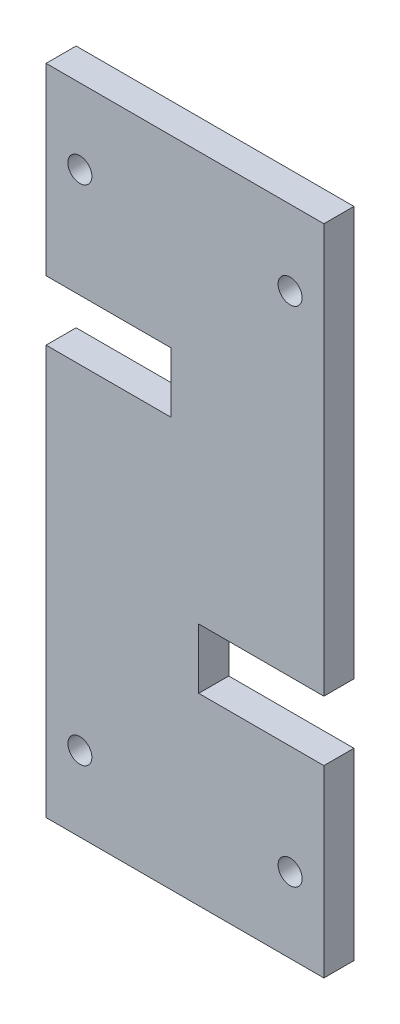
ISO-10303-21;
HEADER;
FILE_DESCRIPTION(('STEP AP214'),'2;1');
FILE_NAME('part.step','',(''),(''),'','','');
FILE_SCHEMA(('AUTOMOTIVE_DESIGN { 1 0 10303 214 1 1 1 1 }'));
ENDSEC;
DATA;
#1=APPLICATION_CONTEXT('core data for automotive mechanical design processes');
#2=APPLICATION_PROTOCOL_DEFINITION('international standard','automotive_design',2000,#1);
#3=PRODUCT_CONTEXT('',#1,'mechanical');
#4=PRODUCT('Part','Part','',(#3));
#5=PRODUCT_RELATED_PRODUCT_CATEGORY('part','',(#4));
#6=PRODUCT_DEFINITION_FORMATION('','',#4);
#7=PRODUCT_DEFINITION_CONTEXT('part definition',#1,'design');
#8=PRODUCT_DEFINITION('design','',#6,#7);
#9=PRODUCT_DEFINITION_SHAPE('','',#8);
#10=(LENGTH_UNIT() NAMED_UNIT(*) SI_UNIT(.MILLI.,.METRE.));
#11=(NAMED_UNIT(*) PLANE_ANGLE_UNIT() SI_UNIT($,.RADIAN.));
#12=(NAMED_UNIT(*) SI_UNIT($,.STERADIAN.) SOLID_ANGLE_UNIT());
#13=UNCERTAINTY_MEASURE_WITH_UNIT(LENGTH_MEASURE(1.E-05),#10,'distance_accuracy_value','');
#14=(GEOMETRIC_REPRESENTATION_CONTEXT(3) GLOBAL_UNCERTAINTY_ASSIGNED_CONTEXT((#13)) GLOBAL_UNIT_ASSIGNED_CONTEXT((#10,
#11,#12)) REPRESENTATION_CONTEXT('',''));
#15=CARTESIAN_POINT('',(0.,0.,0.));
#16=DIRECTION('',(0.,0.,1.));
#17=DIRECTION('',(1.,0.,0.));
#18=AXIS2_PLACEMENT_3D('',#15,#16,#17);
#19=CARTESIAN_POINT('',(18.5,43.5,4.));
#20=DIRECTION('',(-1.,0.,0.));
#21=DIRECTION('',(0.,0.,1.));
#22=AXIS2_PLACEMENT_3D('',#19,#20,#21);
#23=PLANE('',#22);
#24=DIRECTION('',(0.,1.,0.));
#25=VECTOR('',#24,1.);
#26=CARTESIAN_POINT('',(18.5,43.5,0.));
#27=LINE('',#26,#25);
#28=CARTESIAN_POINT('',(18.5,-43.5,0.));
#29=VERTEX_POINT('',#28);
#30=CARTESIAN_POINT('',(18.5,-19.,0.));
#31=VERTEX_POINT('',#30);
#32=EDGE_CURVE('E221',#29,#31,#27,.T.);
#33=ORIENTED_EDGE('',*,*,#32,.T.);
#34=DIRECTION('',(0.,0.,1.));
#35=VECTOR('',#34,1.);
#36=CARTESIAN_POINT('',(18.5,-19.,0.));
#37=LINE('',#36,#35);
#38=CARTESIAN_POINT('',(18.5,-19.,4.));
#39=VERTEX_POINT('',#38);
#40=EDGE_CURVE('E153',#31,#39,#37,.T.);
#41=ORIENTED_EDGE('',*,*,#40,.T.);
#42=DIRECTION('',(0.,1.,0.));
#43=VECTOR('',#42,1.);
#44=CARTESIAN_POINT('',(18.5,43.5,4.));
#45=LINE('',#44,#43);
#46=CARTESIAN_POINT('',(18.5,-43.5,4.));
#47=VERTEX_POINT('',#46);
#48=EDGE_CURVE('E208',#47,#39,#45,.T.);
#49=ORIENTED_EDGE('',*,*,#48,.F.);
#50=DIRECTION('',(0.,0.,-1.));
#51=VECTOR('',#50,1.);
#52=CARTESIAN_POINT('',(18.5,-43.5,4.));
#53=LINE('',#52,#51);
#54=EDGE_CURVE('E220',#47,#29,#53,.T.);
#55=ORIENTED_EDGE('',*,*,#54,.T.);
#56=EDGE_LOOP('',(#33,#41,#49,#55));
#57=FACE_BOUND('',#56,.T.);
#58=ADVANCED_FACE('F35',(#57),#23,.F.);
#59=CARTESIAN_POINT('',(-18.5,43.5,4.));
#60=DIRECTION('',(1.,0.,0.));
#61=DIRECTION('',(0.,0.,-1.));
#62=AXIS2_PLACEMENT_3D('',#59,#60,#61);
#63=PLANE('',#62);
#64=DIRECTION('',(0.,-1.,0.));
#65=VECTOR('',#64,1.);
#66=CARTESIAN_POINT('',(-18.5,43.5,0.));
#67=LINE('',#66,#65);
#68=CARTESIAN_POINT('',(-18.5,43.5,0.));
#69=VERTEX_POINT('',#68);
#70=CARTESIAN_POINT('',(-18.5,19.,0.));
#71=VERTEX_POINT('',#70);
#72=EDGE_CURVE('E226',#69,#71,#67,.T.);
#73=ORIENTED_EDGE('',*,*,#72,.T.);
#74=DIRECTION('',(0.,0.,1.));
#75=VECTOR('',#74,1.);
#76=CARTESIAN_POINT('',(-18.5,19.,0.));
#77=LINE('',#76,#75);
#78=CARTESIAN_POINT('',(-18.5,19.,4.));
#79=VERTEX_POINT('',#78);
#80=EDGE_CURVE('E155',#71,#79,#77,.T.);
#81=ORIENTED_EDGE('',*,*,#80,.T.);
#82=DIRECTION('',(0.,-1.,0.));
#83=VECTOR('',#82,1.);
#84=CARTESIAN_POINT('',(-18.5,43.5,4.));
#85=LINE('',#84,#83);
#86=CARTESIAN_POINT('',(-18.5,43.5,4.));
#87=VERTEX_POINT('',#86);
#88=EDGE_CURVE('E215',#87,#79,#85,.T.);
#89=ORIENTED_EDGE('',*,*,#88,.F.);
#90=DIRECTION('',(0.,0.,-1.));
#91=VECTOR('',#90,1.);
#92=CARTESIAN_POINT('',(-18.5,43.5,4.));
#93=LINE('',#92,#91);
#94=EDGE_CURVE('E43',#87,#69,#93,.T.);
#95=ORIENTED_EDGE('',*,*,#94,.T.);
#96=EDGE_LOOP('',(#73,#81,#89,#95));
#97=FACE_BOUND('',#96,.T.);
#98=ADVANCED_FACE('F240',(#97),#63,.F.);
#99=CARTESIAN_POINT('',(0.,0.,4.));
#100=DIRECTION('',(0.,0.,1.));
#101=DIRECTION('',(1.,0.,0.));
#102=AXIS2_PLACEMENT_3D('',#99,#100,#101);
#103=PLANE('',#102);
#104=DIRECTION('',(-1.,0.,0.));
#105=VECTOR('',#104,1.);
#106=CARTESIAN_POINT('',(-18.5,19.,4.));
#107=LINE('',#106,#105);
#108=CARTESIAN_POINT('',(-1.83,19.,4.));
#109=VERTEX_POINT('',#108);
#110=EDGE_CURVE('E146',#109,#79,#107,.T.);
#111=ORIENTED_EDGE('',*,*,#110,.F.);
#112=DIRECTION('',(0.,1.,0.));
#113=VECTOR('',#112,1.);
#114=CARTESIAN_POINT('',(-1.83,19.,4.));
#115=LINE('',#114,#113);
#116=CARTESIAN_POINT('',(-1.83,11.,4.));
#117=VERTEX_POINT('',#116);
#118=EDGE_CURVE('E148',#117,#109,#115,.T.);
#119=ORIENTED_EDGE('',*,*,#118,.F.);
#120=DIRECTION('',(1.,0.,0.));
#121=VECTOR('',#120,1.);
#122=CARTESIAN_POINT('',(-18.5,11.,4.));
#123=LINE('',#122,#121);
#124=CARTESIAN_POINT('',(-18.5,11.,4.));
#125=VERTEX_POINT('',#124);
#126=EDGE_CURVE('E126',#125,#117,#123,.T.);
#127=ORIENTED_EDGE('',*,*,#126,.F.);
#128=CARTESIAN_POINT('',(-18.5,-43.5,4.));
#129=VERTEX_POINT('',#128);
#130=EDGE_CURVE('E214',#125,#129,#85,.T.);
#131=ORIENTED_EDGE('',*,*,#130,.T.);
#132=DIRECTION('',(1.,0.,0.));
#133=VECTOR('',#132,1.);
#134=CARTESIAN_POINT('',(-18.5,-43.5,4.));
#135=LINE('',#134,#133);
#136=EDGE_CURVE('E218',#129,#47,#135,.T.);
#137=ORIENTED_EDGE('',*,*,#136,.T.);
#138=ORIENTED_EDGE('',*,*,#48,.T.);
#139=DIRECTION('',(1.,0.,0.));
#140=VECTOR('',#139,1.);
#141=CARTESIAN_POINT('',(18.5,-19.,4.));
#142=LINE('',#141,#140);
#143=CARTESIAN_POINT('',(1.83000000000001,-19.,4.));
#144=VERTEX_POINT('',#143);
#145=EDGE_CURVE('E163',#144,#39,#142,.T.);
#146=ORIENTED_EDGE('',*,*,#145,.F.);
#147=DIRECTION('',(0.,-1.,0.));
#148=VECTOR('',#147,1.);
#149=CARTESIAN_POINT('',(1.83000000000001,-11.,4.));
#150=LINE('',#149,#148);
#151=CARTESIAN_POINT('',(1.83000000000001,-11.,4.));
#152=VERTEX_POINT('',#151);
#153=EDGE_CURVE('E173',#152,#144,#150,.T.);
#154=ORIENTED_EDGE('',*,*,#153,.F.);
#155=DIRECTION('',(-1.,0.,0.));
#156=VECTOR('',#155,1.);
#157=CARTESIAN_POINT('',(18.5,-11.,4.));
#158=LINE('',#157,#156);
#159=CARTESIAN_POINT('',(18.5,-11.,4.));
#160=VERTEX_POINT('',#159);
#161=EDGE_CURVE('E170',#160,#152,#158,.T.);
#162=ORIENTED_EDGE('',*,*,#161,.F.);
#163=CARTESIAN_POINT('',(18.5,43.5,4.));
#164=VERTEX_POINT('',#163);
#165=EDGE_CURVE('E212',#160,#164,#45,.T.);
#166=ORIENTED_EDGE('',*,*,#165,.T.);
#167=DIRECTION('',(-1.,0.,0.));
#168=VECTOR('',#167,1.);
#169=CARTESIAN_POINT('',(-18.5,43.5,4.));
#170=LINE('',#169,#168);
#171=EDGE_CURVE('E211',#164,#87,#170,.T.);
#172=ORIENTED_EDGE('',*,*,#171,.T.);
#173=ORIENTED_EDGE('',*,*,#88,.T.);
#174=EDGE_LOOP('',(#111,#119,#127,#131,#137,#138,#146,#154,#162,#166,#172,#173));
#175=FACE_BOUND('',#174,.T.);
#176=CARTESIAN_POINT('',(-14.,-33.5,4.));
#177=DIRECTION('',(0.,0.,1.));
#178=DIRECTION('',(1.,0.,0.));
#179=AXIS2_PLACEMENT_3D('',#176,#177,#178);
#180=CIRCLE('',#179,1.6);
#181=CARTESIAN_POINT('',(-12.4,-33.5,4.));
#182=VERTEX_POINT('',#181);
#183=EDGE_CURVE('E190',#182,#182,#180,.T.);
#184=ORIENTED_EDGE('',*,*,#183,.F.);
#185=EDGE_LOOP('',(#184));
#186=FACE_BOUND('',#185,.T.);
#187=CARTESIAN_POINT('',(-14.,33.5,4.));
#188=DIRECTION('',(0.,0.,1.));
#189=DIRECTION('',(1.,0.,0.));
#190=AXIS2_PLACEMENT_3D('',#187,#188,#189);
#191=CIRCLE('',#190,1.6);
#192=CARTESIAN_POINT('',(-12.4,33.5,4.));
#193=VERTEX_POINT('',#192);
#194=EDGE_CURVE('E202',#193,#193,#191,.T.);
#195=ORIENTED_EDGE('',*,*,#194,.F.);
#196=EDGE_LOOP('',(#195));
#197=FACE_BOUND('',#196,.T.);
#198=CARTESIAN_POINT('',(14.,33.5,4.));
#199=DIRECTION('',(0.,0.,1.));
#200=DIRECTION('',(1.,0.,0.));
#201=AXIS2_PLACEMENT_3D('',#198,#199,#200);
#202=CIRCLE('',#201,1.6);
#203=CARTESIAN_POINT('',(15.6,33.5,4.));
#204=VERTEX_POINT('',#203);
#205=EDGE_CURVE('E196',#204,#204,#202,.T.);
#206=ORIENTED_EDGE('',*,*,#205,.F.);
#207=EDGE_LOOP('',(#206));
#208=FACE_BOUND('',#207,.T.);
#209=CARTESIAN_POINT('',(14.,-33.5,4.));
#210=DIRECTION('',(0.,0.,1.));
#211=DIRECTION('',(1.,0.,0.));
#212=AXIS2_PLACEMENT_3D('',#209,#210,#211);
#213=CIRCLE('',#212,1.6);
#214=CARTESIAN_POINT('',(15.6,-33.5,4.));
#215=VERTEX_POINT('',#214);
#216=EDGE_CURVE('E184',#215,#215,#213,.T.);
#217=ORIENTED_EDGE('',*,*,#216,.F.);
#218=EDGE_LOOP('',(#217));
#219=FACE_BOUND('',#218,.T.);
#220=ADVANCED_FACE('F249',(#175,#186,#197,#208,#219),#103,.T.);
#221=CARTESIAN_POINT('',(0.,0.,0.));
#222=DIRECTION('',(0.,0.,1.));
#223=DIRECTION('',(1.,0.,0.));
#224=AXIS2_PLACEMENT_3D('',#221,#222,#223);
#225=PLANE('',#224);
#226=DIRECTION('',(0.,1.,0.));
#227=VECTOR('',#226,1.);
#228=CARTESIAN_POINT('',(-1.83,19.,0.));
#229=LINE('',#228,#227);
#230=CARTESIAN_POINT('',(-1.83,11.,0.));
#231=VERTEX_POINT('',#230);
#232=CARTESIAN_POINT('',(-1.83,19.,0.));
#233=VERTEX_POINT('',#232);
#234=EDGE_CURVE('E134',#231,#233,#229,.T.);
#235=ORIENTED_EDGE('',*,*,#234,.T.);
#236=DIRECTION('',(-1.,0.,0.));
#237=VECTOR('',#236,1.);
#238=CARTESIAN_POINT('',(-18.5,19.,0.));
#239=LINE('',#238,#237);
#240=EDGE_CURVE('E139',#233,#71,#239,.T.);
#241=ORIENTED_EDGE('',*,*,#240,.T.);
#242=ORIENTED_EDGE('',*,*,#72,.F.);
#243=DIRECTION('',(-1.,0.,0.));
#244=VECTOR('',#243,1.);
#245=CARTESIAN_POINT('',(-18.5,43.5,0.));
#246=LINE('',#245,#244);
#247=CARTESIAN_POINT('',(18.5,43.5,0.));
#248=VERTEX_POINT('',#247);
#249=EDGE_CURVE('E224',#248,#69,#246,.T.);
#250=ORIENTED_EDGE('',*,*,#249,.F.);
#251=CARTESIAN_POINT('',(18.5,-11.,0.));
#252=VERTEX_POINT('',#251);
#253=EDGE_CURVE('E205',#252,#248,#27,.T.);
#254=ORIENTED_EDGE('',*,*,#253,.F.);
#255=DIRECTION('',(-1.,0.,0.));
#256=VECTOR('',#255,1.);
#257=CARTESIAN_POINT('',(18.5,-11.,0.));
#258=LINE('',#257,#256);
#259=CARTESIAN_POINT('',(1.83000000000001,-11.,0.));
#260=VERTEX_POINT('',#259);
#261=EDGE_CURVE('E50',#252,#260,#258,.T.);
#262=ORIENTED_EDGE('',*,*,#261,.T.);
#263=DIRECTION('',(0.,-1.,0.));
#264=VECTOR('',#263,1.);
#265=CARTESIAN_POINT('',(1.83000000000001,-11.,0.));
#266=LINE('',#265,#264);
#267=CARTESIAN_POINT('',(1.83000000000001,-19.,0.));
#268=VERTEX_POINT('',#267);
#269=EDGE_CURVE('E162',#260,#268,#266,.T.);
#270=ORIENTED_EDGE('',*,*,#269,.T.);
#271=DIRECTION('',(1.,0.,0.));
#272=VECTOR('',#271,1.);
#273=CARTESIAN_POINT('',(18.5,-19.,0.));
#274=LINE('',#273,#272);
#275=EDGE_CURVE('E166',#268,#31,#274,.T.);
#276=ORIENTED_EDGE('',*,*,#275,.T.);
#277=ORIENTED_EDGE('',*,*,#32,.F.);
#278=DIRECTION('',(1.,0.,0.));
#279=VECTOR('',#278,1.);
#280=CARTESIAN_POINT('',(-18.5,-43.5,0.));
#281=LINE('',#280,#279);
#282=CARTESIAN_POINT('',(-18.5,-43.5,0.));
#283=VERTEX_POINT('',#282);
#284=EDGE_CURVE('E229',#283,#29,#281,.T.);
#285=ORIENTED_EDGE('',*,*,#284,.F.);
#286=CARTESIAN_POINT('',(-18.5,11.,0.));
#287=VERTEX_POINT('',#286);
#288=EDGE_CURVE('E145',#287,#283,#67,.T.);
#289=ORIENTED_EDGE('',*,*,#288,.F.);
#290=DIRECTION('',(1.,0.,0.));
#291=VECTOR('',#290,1.);
#292=CARTESIAN_POINT('',(-18.5,11.,0.));
#293=LINE('',#292,#291);
#294=EDGE_CURVE('E58',#287,#231,#293,.T.);
#295=ORIENTED_EDGE('',*,*,#294,.T.);
#296=EDGE_LOOP('',(#235,#241,#242,#250,#254,#262,#270,#276,#277,#285,#289,#295));
#297=FACE_BOUND('',#296,.T.);
#298=CARTESIAN_POINT('',(-14.,33.5,0.));
#299=DIRECTION('',(0.,0.,1.));
#300=DIRECTION('',(1.,0.,0.));
#301=AXIS2_PLACEMENT_3D('',#298,#299,#300);
#302=CIRCLE('',#301,1.6);
#303=CARTESIAN_POINT('',(-12.4,33.5,0.));
#304=VERTEX_POINT('',#303);
#305=EDGE_CURVE('E199',#304,#304,#302,.T.);
#306=ORIENTED_EDGE('',*,*,#305,.T.);
#307=EDGE_LOOP('',(#306));
#308=FACE_BOUND('',#307,.T.);
#309=CARTESIAN_POINT('',(14.,33.5,0.));
#310=DIRECTION('',(0.,0.,1.));
#311=DIRECTION('',(1.,0.,0.));
#312=AXIS2_PLACEMENT_3D('',#309,#310,#311);
#313=CIRCLE('',#312,1.6);
#314=CARTESIAN_POINT('',(15.6,33.5,0.));
#315=VERTEX_POINT('',#314);
#316=EDGE_CURVE('E193',#315,#315,#313,.T.);
#317=ORIENTED_EDGE('',*,*,#316,.T.);
#318=EDGE_LOOP('',(#317));
#319=FACE_BOUND('',#318,.T.);
#320=CARTESIAN_POINT('',(-14.,-33.5,0.));
#321=DIRECTION('',(0.,0.,1.));
#322=DIRECTION('',(1.,0.,0.));
#323=AXIS2_PLACEMENT_3D('',#320,#321,#322);
#324=CIRCLE('',#323,1.6);
#325=CARTESIAN_POINT('',(-12.4,-33.5,0.));
#326=VERTEX_POINT('',#325);
#327=EDGE_CURVE('E187',#326,#326,#324,.T.);
#328=ORIENTED_EDGE('',*,*,#327,.T.);
#329=EDGE_LOOP('',(#328));
#330=FACE_BOUND('',#329,.T.);
#331=CARTESIAN_POINT('',(14.,-33.5,0.));
#332=DIRECTION('',(0.,0.,1.));
#333=DIRECTION('',(1.,0.,0.));
#334=AXIS2_PLACEMENT_3D('',#331,#332,#333);
#335=CIRCLE('',#334,1.6);
#336=CARTESIAN_POINT('',(15.6,-33.5,0.));
#337=VERTEX_POINT('',#336);
#338=EDGE_CURVE('E158',#337,#337,#335,.T.);
#339=ORIENTED_EDGE('',*,*,#338,.T.);
#340=EDGE_LOOP('',(#339));
#341=FACE_BOUND('',#340,.T.);
#342=ADVANCED_FACE('F142',(#297,#308,#319,#330,#341),#225,.F.);
#343=ORIENTED_EDGE('',*,*,#165,.F.);
#344=DIRECTION('',(0.,0.,1.));
#345=VECTOR('',#344,1.);
#346=CARTESIAN_POINT('',(18.5,-11.,0.));
#347=LINE('',#346,#345);
#348=EDGE_CURVE('E169',#252,#160,#347,.T.);
#349=ORIENTED_EDGE('',*,*,#348,.F.);
#350=ORIENTED_EDGE('',*,*,#253,.T.);
#351=DIRECTION('',(0.,0.,-1.));
#352=VECTOR('',#351,1.);
#353=CARTESIAN_POINT('',(18.5,43.5,4.));
#354=LINE('',#353,#352);
#355=EDGE_CURVE('E11',#164,#248,#354,.T.);
#356=ORIENTED_EDGE('',*,*,#355,.F.);
#357=EDGE_LOOP('',(#343,#349,#350,#356));
#358=FACE_BOUND('',#357,.T.);
#359=ADVANCED_FACE('F37',(#358),#23,.F.);
#360=CARTESIAN_POINT('',(-18.5,43.5,4.));
#361=DIRECTION('',(0.,-1.,0.));
#362=DIRECTION('',(0.,0.,-1.));
#363=AXIS2_PLACEMENT_3D('',#360,#361,#362);
#364=PLANE('',#363);
#365=ORIENTED_EDGE('',*,*,#249,.T.);
#366=ORIENTED_EDGE('',*,*,#94,.F.);
#367=ORIENTED_EDGE('',*,*,#171,.F.);
#368=ORIENTED_EDGE('',*,*,#355,.T.);
#369=EDGE_LOOP('',(#365,#366,#367,#368));
#370=FACE_BOUND('',#369,.T.);
#371=ADVANCED_FACE('F254',(#370),#364,.F.);
#372=ORIENTED_EDGE('',*,*,#130,.F.);
#373=DIRECTION('',(0.,0.,1.));
#374=VECTOR('',#373,1.);
#375=CARTESIAN_POINT('',(-18.5,11.,0.));
#376=LINE('',#375,#374);
#377=EDGE_CURVE('E131',#287,#125,#376,.T.);
#378=ORIENTED_EDGE('',*,*,#377,.F.);
#379=ORIENTED_EDGE('',*,*,#288,.T.);
#380=DIRECTION('',(0.,0.,-1.));
#381=VECTOR('',#380,1.);
#382=CARTESIAN_POINT('',(-18.5,-43.5,4.));
#383=LINE('',#382,#381);
#384=EDGE_CURVE('E233',#129,#283,#383,.T.);
#385=ORIENTED_EDGE('',*,*,#384,.F.);
#386=EDGE_LOOP('',(#372,#378,#379,#385));
#387=FACE_BOUND('',#386,.T.);
#388=ADVANCED_FACE('F274',(#387),#63,.F.);
#389=CARTESIAN_POINT('',(-18.5,-43.5,4.));
#390=DIRECTION('',(0.,1.,0.));
#391=DIRECTION('',(0.,0.,1.));
#392=AXIS2_PLACEMENT_3D('',#389,#390,#391);
#393=PLANE('',#392);
#394=ORIENTED_EDGE('',*,*,#284,.T.);
#395=ORIENTED_EDGE('',*,*,#54,.F.);
#396=ORIENTED_EDGE('',*,*,#136,.F.);
#397=ORIENTED_EDGE('',*,*,#384,.T.);
#398=EDGE_LOOP('',(#394,#395,#396,#397));
#399=FACE_BOUND('',#398,.T.);
#400=ADVANCED_FACE('F272',(#399),#393,.F.);
#401=CARTESIAN_POINT('',(-14.,33.5,4.));
#402=DIRECTION('',(0.,0.,-1.));
#403=DIRECTION('',(-1.,0.,0.));
#404=AXIS2_PLACEMENT_3D('',#401,#402,#403);
#405=CYLINDRICAL_SURFACE('',#404,1.6);
#406=ORIENTED_EDGE('',*,*,#194,.T.);
#407=EDGE_LOOP('',(#406));
#408=FACE_BOUND('',#407,.T.);
#409=ORIENTED_EDGE('',*,*,#305,.F.);
#410=EDGE_LOOP('',(#409));
#411=FACE_BOUND('',#410,.T.);
#412=ADVANCED_FACE('F281',(#408,#411),#405,.F.);
#413=CARTESIAN_POINT('',(14.,33.5,4.));
#414=DIRECTION('',(0.,0.,-1.));
#415=DIRECTION('',(-1.,0.,0.));
#416=AXIS2_PLACEMENT_3D('',#413,#414,#415);
#417=CYLINDRICAL_SURFACE('',#416,1.6);
#418=ORIENTED_EDGE('',*,*,#205,.T.);
#419=EDGE_LOOP('',(#418));
#420=FACE_BOUND('',#419,.T.);
#421=ORIENTED_EDGE('',*,*,#316,.F.);
#422=EDGE_LOOP('',(#421));
#423=FACE_BOUND('',#422,.T.);
#424=ADVANCED_FACE('F299',(#420,#423),#417,.F.);
#425=CARTESIAN_POINT('',(-14.,-33.5,4.));
#426=DIRECTION('',(0.,0.,-1.));
#427=DIRECTION('',(-1.,0.,0.));
#428=AXIS2_PLACEMENT_3D('',#425,#426,#427);
#429=CYLINDRICAL_SURFACE('',#428,1.6);
#430=ORIENTED_EDGE('',*,*,#183,.T.);
#431=EDGE_LOOP('',(#430));
#432=FACE_BOUND('',#431,.T.);
#433=ORIENTED_EDGE('',*,*,#327,.F.);
#434=EDGE_LOOP('',(#433));
#435=FACE_BOUND('',#434,.T.);
#436=ADVANCED_FACE('F303',(#432,#435),#429,.F.);
#437=CARTESIAN_POINT('',(14.,-33.5,4.));
#438=DIRECTION('',(0.,0.,-1.));
#439=DIRECTION('',(-1.,0.,0.));
#440=AXIS2_PLACEMENT_3D('',#437,#438,#439);
#441=CYLINDRICAL_SURFACE('',#440,1.6);
#442=ORIENTED_EDGE('',*,*,#216,.T.);
#443=EDGE_LOOP('',(#442));
#444=FACE_BOUND('',#443,.T.);
#445=ORIENTED_EDGE('',*,*,#338,.F.);
#446=EDGE_LOOP('',(#445));
#447=FACE_BOUND('',#446,.T.);
#448=ADVANCED_FACE('F307',(#444,#447),#441,.F.);
#449=CARTESIAN_POINT('',(-18.5,19.,0.));
#450=DIRECTION('',(0.,1.,0.));
#451=DIRECTION('',(0.,0.,1.));
#452=AXIS2_PLACEMENT_3D('',#449,#450,#451);
#453=PLANE('',#452);
#454=ORIENTED_EDGE('',*,*,#110,.T.);
#455=ORIENTED_EDGE('',*,*,#80,.F.);
#456=ORIENTED_EDGE('',*,*,#240,.F.);
#457=DIRECTION('',(0.,0.,1.));
#458=VECTOR('',#457,1.);
#459=CARTESIAN_POINT('',(-1.83,19.,0.));
#460=LINE('',#459,#458);
#461=EDGE_CURVE('E130',#233,#109,#460,.T.);
#462=ORIENTED_EDGE('',*,*,#461,.T.);
#463=EDGE_LOOP('',(#454,#455,#456,#462));
#464=FACE_BOUND('',#463,.T.);
#465=ADVANCED_FACE('F246',(#464),#453,.F.);
#466=CARTESIAN_POINT('',(-1.83,19.,0.));
#467=DIRECTION('',(1.,0.,0.));
#468=DIRECTION('',(0.,1.,0.));
#469=AXIS2_PLACEMENT_3D('',#466,#467,#468);
#470=PLANE('',#469);
#471=ORIENTED_EDGE('',*,*,#118,.T.);
#472=ORIENTED_EDGE('',*,*,#461,.F.);
#473=ORIENTED_EDGE('',*,*,#234,.F.);
#474=DIRECTION('',(0.,0.,1.));
#475=VECTOR('',#474,1.);
#476=CARTESIAN_POINT('',(-1.83,11.,0.));
#477=LINE('',#476,#475);
#478=EDGE_CURVE('E122',#231,#117,#477,.T.);
#479=ORIENTED_EDGE('',*,*,#478,.T.);
#480=EDGE_LOOP('',(#471,#472,#473,#479));
#481=FACE_BOUND('',#480,.T.);
#482=ADVANCED_FACE('F135',(#481),#470,.F.);
#483=CARTESIAN_POINT('',(-18.5,11.,0.));
#484=DIRECTION('',(0.,-1.,0.));
#485=DIRECTION('',(0.,0.,-1.));
#486=AXIS2_PLACEMENT_3D('',#483,#484,#485);
#487=PLANE('',#486);
#488=ORIENTED_EDGE('',*,*,#126,.T.);
#489=ORIENTED_EDGE('',*,*,#478,.F.);
#490=ORIENTED_EDGE('',*,*,#294,.F.);
#491=ORIENTED_EDGE('',*,*,#377,.T.);
#492=EDGE_LOOP('',(#488,#489,#490,#491));
#493=FACE_BOUND('',#492,.T.);
#494=ADVANCED_FACE('F124',(#493),#487,.F.);
#495=CARTESIAN_POINT('',(18.5,-19.,0.));
#496=DIRECTION('',(0.,-1.,0.));
#497=DIRECTION('',(1.,0.,0.));
#498=AXIS2_PLACEMENT_3D('',#495,#496,#497);
#499=PLANE('',#498);
#500=ORIENTED_EDGE('',*,*,#145,.T.);
#501=ORIENTED_EDGE('',*,*,#40,.F.);
#502=ORIENTED_EDGE('',*,*,#275,.F.);
#503=DIRECTION('',(0.,0.,1.));
#504=VECTOR('',#503,1.);
#505=CARTESIAN_POINT('',(1.83000000000001,-19.,0.));
#506=LINE('',#505,#504);
#507=EDGE_CURVE('E179',#268,#144,#506,.T.);
#508=ORIENTED_EDGE('',*,*,#507,.T.);
#509=EDGE_LOOP('',(#500,#501,#502,#508));
#510=FACE_BOUND('',#509,.T.);
#511=ADVANCED_FACE('F264',(#510),#499,.F.);
#512=CARTESIAN_POINT('',(1.83000000000001,-11.,0.));
#513=DIRECTION('',(-1.,0.,0.));
#514=DIRECTION('',(0.,-1.,0.));
#515=AXIS2_PLACEMENT_3D('',#512,#513,#514);
#516=PLANE('',#515);
#517=ORIENTED_EDGE('',*,*,#153,.T.);
#518=ORIENTED_EDGE('',*,*,#507,.F.);
#519=ORIENTED_EDGE('',*,*,#269,.F.);
#520=DIRECTION('',(0.,0.,1.));
#521=VECTOR('',#520,1.);
#522=CARTESIAN_POINT('',(1.83000000000001,-11.,0.));
#523=LINE('',#522,#521);
#524=EDGE_CURVE('E181',#260,#152,#523,.T.);
#525=ORIENTED_EDGE('',*,*,#524,.T.);
#526=EDGE_LOOP('',(#517,#518,#519,#525));
#527=FACE_BOUND('',#526,.T.);
#528=ADVANCED_FACE('F260',(#527),#516,.F.);
#529=CARTESIAN_POINT('',(18.5,-11.,0.));
#530=DIRECTION('',(0.,1.,0.));
#531=DIRECTION('',(-1.,0.,0.));
#532=AXIS2_PLACEMENT_3D('',#529,#530,#531);
#533=PLANE('',#532);
#534=ORIENTED_EDGE('',*,*,#161,.T.);
#535=ORIENTED_EDGE('',*,*,#524,.F.);
#536=ORIENTED_EDGE('',*,*,#261,.F.);
#537=ORIENTED_EDGE('',*,*,#348,.T.);
#538=EDGE_LOOP('',(#534,#535,#536,#537));
#539=FACE_BOUND('',#538,.T.);
#540=ADVANCED_FACE('F312',(#539),#533,.F.);
#541=CLOSED_SHELL('',(#58,#98,#220,#342,#359,#371,#388,#400,#412,#424,#436,#448,#465,#482,#494,
#511,#528,#540));
#542=MANIFOLD_SOLID_BREP('B2',#541);
#543=ADVANCED_BREP_SHAPE_REPRESENTATION('',(#18,#542),#14);
#544=SHAPE_DEFINITION_REPRESENTATION(#9,#543);
ENDSEC;
END-ISO-10303-21;
